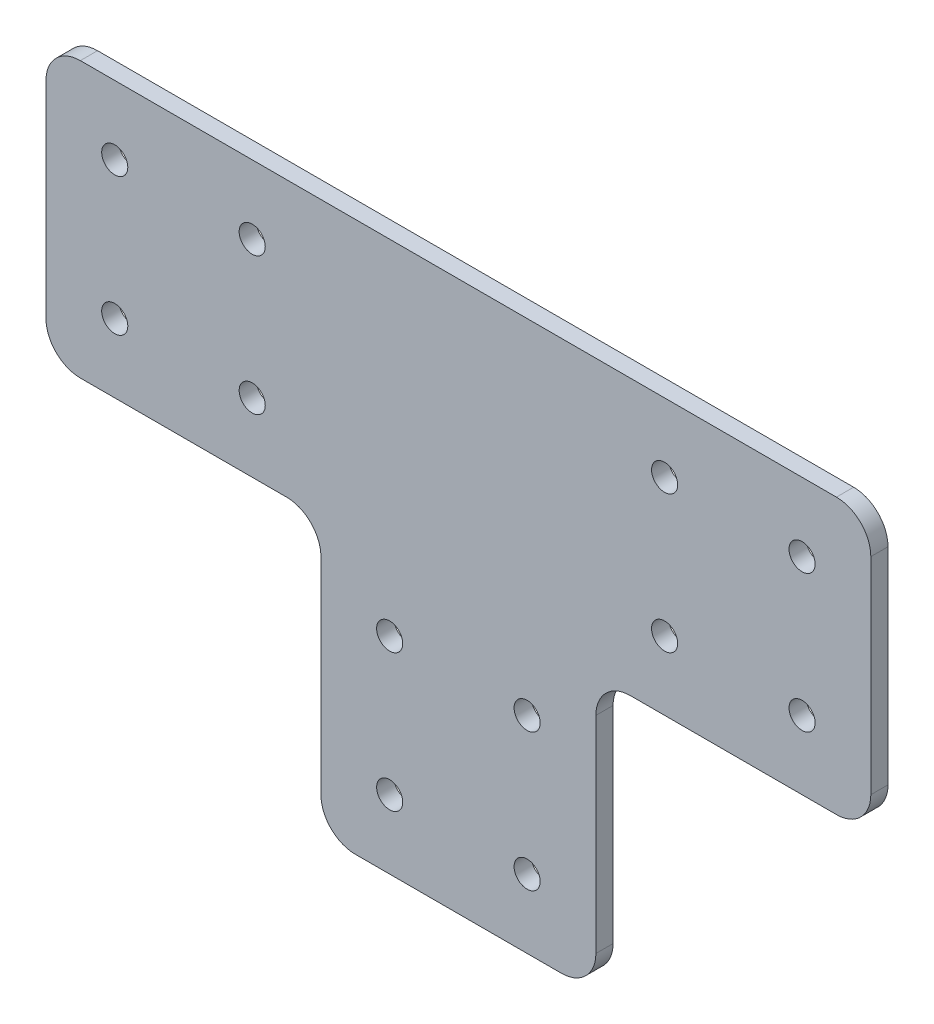
ISO-10303-21;
HEADER;
FILE_DESCRIPTION(('STEP AP214'),'2;1');
FILE_NAME('part.step','',(''),(''),'','','');
FILE_SCHEMA(('AUTOMOTIVE_DESIGN { 1 0 10303 214 1 1 1 1 }'));
ENDSEC;
DATA;
#1=APPLICATION_CONTEXT('core data for automotive mechanical design processes');
#2=APPLICATION_PROTOCOL_DEFINITION('international standard','automotive_design',2000,#1);
#3=PRODUCT_CONTEXT('',#1,'mechanical');
#4=PRODUCT('Part','Part','',(#3));
#5=PRODUCT_RELATED_PRODUCT_CATEGORY('part','',(#4));
#6=PRODUCT_DEFINITION_FORMATION('','',#4);
#7=PRODUCT_DEFINITION_CONTEXT('part definition',#1,'design');
#8=PRODUCT_DEFINITION('design','',#6,#7);
#9=PRODUCT_DEFINITION_SHAPE('','',#8);
#10=(LENGTH_UNIT() NAMED_UNIT(*) SI_UNIT(.MILLI.,.METRE.));
#11=(NAMED_UNIT(*) PLANE_ANGLE_UNIT() SI_UNIT($,.RADIAN.));
#12=(NAMED_UNIT(*) SI_UNIT($,.STERADIAN.) SOLID_ANGLE_UNIT());
#13=UNCERTAINTY_MEASURE_WITH_UNIT(LENGTH_MEASURE(1.E-05),#10,'distance_accuracy_value','');
#14=(GEOMETRIC_REPRESENTATION_CONTEXT(3) GLOBAL_UNCERTAINTY_ASSIGNED_CONTEXT((#13)) GLOBAL_UNIT_ASSIGNED_CONTEXT((#10,
#11,#12)) REPRESENTATION_CONTEXT('',''));
#15=CARTESIAN_POINT('',(0.,0.,0.));
#16=DIRECTION('',(0.,0.,1.));
#17=DIRECTION('',(1.,0.,0.));
#18=AXIS2_PLACEMENT_3D('',#15,#16,#17);
#19=CARTESIAN_POINT('',(0.,0.,3.175));
#20=DIRECTION('',(0.,0.,-1.));
#21=DIRECTION('',(-1.,0.,0.));
#22=AXIS2_PLACEMENT_3D('',#19,#20,#21);
#23=PLANE('',#22);
#24=DIRECTION('',(1.,0.,0.));
#25=VECTOR('',#24,1.);
#26=CARTESIAN_POINT('',(25.4,-101.6,3.175));
#27=LINE('',#26,#25);
#28=CARTESIAN_POINT('',(-19.05,-101.6,3.175));
#29=VERTEX_POINT('',#28);
#30=CARTESIAN_POINT('',(19.05,-101.6,3.175));
#31=VERTEX_POINT('',#30);
#32=EDGE_CURVE('E185',#29,#31,#27,.T.);
#33=ORIENTED_EDGE('',*,*,#32,.T.);
#34=CARTESIAN_POINT('',(19.05,-95.25,3.175));
#35=DIRECTION('',(0.,0.,-1.));
#36=DIRECTION('',(-1.,0.,0.));
#37=AXIS2_PLACEMENT_3D('',#34,#35,#36);
#38=CIRCLE('',#37,6.35);
#39=CARTESIAN_POINT('',(25.4,-95.25,3.175));
#40=VERTEX_POINT('',#39);
#41=EDGE_CURVE('E225',#31,#40,#38,.F.);
#42=ORIENTED_EDGE('',*,*,#41,.T.);
#43=DIRECTION('',(0.,1.,0.));
#44=VECTOR('',#43,1.);
#45=CARTESIAN_POINT('',(25.4,-50.8,3.175));
#46=LINE('',#45,#44);
#47=CARTESIAN_POINT('',(25.4,-57.15,3.175));
#48=VERTEX_POINT('',#47);
#49=EDGE_CURVE('E168',#40,#48,#46,.T.);
#50=ORIENTED_EDGE('',*,*,#49,.T.);
#51=CARTESIAN_POINT('',(31.75,-57.15,3.175));
#52=DIRECTION('',(0.,0.,-1.));
#53=DIRECTION('',(-1.,0.,0.));
#54=AXIS2_PLACEMENT_3D('',#51,#52,#53);
#55=CIRCLE('',#54,6.35);
#56=CARTESIAN_POINT('',(31.75,-50.8,3.175));
#57=VERTEX_POINT('',#56);
#58=EDGE_CURVE('E11',#48,#57,#55,.T.);
#59=ORIENTED_EDGE('',*,*,#58,.T.);
#60=DIRECTION('',(1.,0.,0.));
#61=VECTOR('',#60,1.);
#62=CARTESIAN_POINT('',(76.2,-50.8,3.175));
#63=LINE('',#62,#61);
#64=CARTESIAN_POINT('',(69.85,-50.8,3.175));
#65=VERTEX_POINT('',#64);
#66=EDGE_CURVE('E284',#57,#65,#63,.T.);
#67=ORIENTED_EDGE('',*,*,#66,.T.);
#68=CARTESIAN_POINT('',(69.85,-44.45,3.175));
#69=DIRECTION('',(0.,0.,-1.));
#70=DIRECTION('',(-1.,0.,0.));
#71=AXIS2_PLACEMENT_3D('',#68,#69,#70);
#72=CIRCLE('',#71,6.35);
#73=CARTESIAN_POINT('',(76.2,-44.45,3.175));
#74=VERTEX_POINT('',#73);
#75=EDGE_CURVE('E217',#65,#74,#72,.F.);
#76=ORIENTED_EDGE('',*,*,#75,.T.);
#77=DIRECTION('',(0.,1.,0.));
#78=VECTOR('',#77,1.);
#79=CARTESIAN_POINT('',(76.2,0.,3.175));
#80=LINE('',#79,#78);
#81=CARTESIAN_POINT('',(76.2,-6.35,3.175));
#82=VERTEX_POINT('',#81);
#83=EDGE_CURVE('E281',#74,#82,#80,.T.);
#84=ORIENTED_EDGE('',*,*,#83,.T.);
#85=CARTESIAN_POINT('',(69.85,-6.35,3.175));
#86=DIRECTION('',(0.,0.,-1.));
#87=DIRECTION('',(-1.,0.,0.));
#88=AXIS2_PLACEMENT_3D('',#85,#86,#87);
#89=CIRCLE('',#88,6.35);
#90=CARTESIAN_POINT('',(69.85,0.,3.175));
#91=VERTEX_POINT('',#90);
#92=EDGE_CURVE('E219',#82,#91,#89,.F.);
#93=ORIENTED_EDGE('',*,*,#92,.T.);
#94=DIRECTION('',(-1.,0.,0.));
#95=VECTOR('',#94,1.);
#96=CARTESIAN_POINT('',(-76.2,0.,3.175));
#97=LINE('',#96,#95);
#98=CARTESIAN_POINT('',(-69.85,0.,3.175));
#99=VERTEX_POINT('',#98);
#100=EDGE_CURVE('E278',#91,#99,#97,.T.);
#101=ORIENTED_EDGE('',*,*,#100,.T.);
#102=CARTESIAN_POINT('',(-69.85,-6.35,3.175));
#103=DIRECTION('',(0.,0.,-1.));
#104=DIRECTION('',(-1.,0.,0.));
#105=AXIS2_PLACEMENT_3D('',#102,#103,#104);
#106=CIRCLE('',#105,6.35);
#107=CARTESIAN_POINT('',(-76.2,-6.35,3.175));
#108=VERTEX_POINT('',#107);
#109=EDGE_CURVE('E215',#99,#108,#106,.F.);
#110=ORIENTED_EDGE('',*,*,#109,.T.);
#111=DIRECTION('',(0.,-1.,0.));
#112=VECTOR('',#111,1.);
#113=CARTESIAN_POINT('',(-76.2,-50.8,3.175));
#114=LINE('',#113,#112);
#115=CARTESIAN_POINT('',(-76.2,-44.45,3.175));
#116=VERTEX_POINT('',#115);
#117=EDGE_CURVE('E273',#108,#116,#114,.T.);
#118=ORIENTED_EDGE('',*,*,#117,.T.);
#119=CARTESIAN_POINT('',(-69.85,-44.45,3.175));
#120=DIRECTION('',(0.,0.,-1.));
#121=DIRECTION('',(-1.,0.,0.));
#122=AXIS2_PLACEMENT_3D('',#119,#120,#121);
#123=CIRCLE('',#122,6.35);
#124=CARTESIAN_POINT('',(-69.85,-50.8,3.175));
#125=VERTEX_POINT('',#124);
#126=EDGE_CURVE('E221',#116,#125,#123,.F.);
#127=ORIENTED_EDGE('',*,*,#126,.T.);
#128=DIRECTION('',(1.,0.,0.));
#129=VECTOR('',#128,1.);
#130=CARTESIAN_POINT('',(-25.4,-50.8,3.175));
#131=LINE('',#130,#129);
#132=CARTESIAN_POINT('',(-31.75,-50.8,3.175));
#133=VERTEX_POINT('',#132);
#134=EDGE_CURVE('E271',#125,#133,#131,.T.);
#135=ORIENTED_EDGE('',*,*,#134,.T.);
#136=CARTESIAN_POINT('',(-31.75,-57.15,3.175));
#137=DIRECTION('',(0.,0.,-1.));
#138=DIRECTION('',(-1.,0.,0.));
#139=AXIS2_PLACEMENT_3D('',#136,#137,#138);
#140=CIRCLE('',#139,6.35);
#141=CARTESIAN_POINT('',(-25.4,-57.15,3.175));
#142=VERTEX_POINT('',#141);
#143=EDGE_CURVE('E56',#133,#142,#140,.T.);
#144=ORIENTED_EDGE('',*,*,#143,.T.);
#145=DIRECTION('',(0.,-1.,0.));
#146=VECTOR('',#145,1.);
#147=CARTESIAN_POINT('',(-25.4,-101.6,3.175));
#148=LINE('',#147,#146);
#149=CARTESIAN_POINT('',(-25.4,-95.25,3.175));
#150=VERTEX_POINT('',#149);
#151=EDGE_CURVE('E269',#142,#150,#148,.T.);
#152=ORIENTED_EDGE('',*,*,#151,.T.);
#153=CARTESIAN_POINT('',(-19.05,-95.25,3.175));
#154=DIRECTION('',(0.,0.,-1.));
#155=DIRECTION('',(-1.,0.,0.));
#156=AXIS2_PLACEMENT_3D('',#153,#154,#155);
#157=CIRCLE('',#156,6.35);
#158=EDGE_CURVE('E223',#150,#29,#157,.F.);
#159=ORIENTED_EDGE('',*,*,#158,.T.);
#160=EDGE_LOOP('',(#33,#42,#50,#59,#67,#76,#84,#93,#101,#110,#118,#127,#135,#144,#152,#159));
#161=FACE_BOUND('',#160,.T.);
#162=CARTESIAN_POINT('',(-63.5,-12.7,3.175));
#163=DIRECTION('',(0.,0.,1.));
#164=DIRECTION('',(1.,0.,0.));
#165=AXIS2_PLACEMENT_3D('',#162,#163,#164);
#166=CIRCLE('',#165,2.41299999999999);
#167=CARTESIAN_POINT('',(-61.087,-12.7,3.175));
#168=VERTEX_POINT('',#167);
#169=EDGE_CURVE('E176',#168,#168,#166,.T.);
#170=ORIENTED_EDGE('',*,*,#169,.F.);
#171=EDGE_LOOP('',(#170));
#172=FACE_BOUND('',#171,.T.);
#173=CARTESIAN_POINT('',(-63.5,-38.1,3.175));
#174=DIRECTION('',(0.,0.,1.));
#175=DIRECTION('',(1.,0.,0.));
#176=AXIS2_PLACEMENT_3D('',#173,#174,#175);
#177=CIRCLE('',#176,2.41299999999999);
#178=CARTESIAN_POINT('',(-61.087,-38.1,3.175));
#179=VERTEX_POINT('',#178);
#180=EDGE_CURVE('E289',#179,#179,#177,.T.);
#181=ORIENTED_EDGE('',*,*,#180,.F.);
#182=EDGE_LOOP('',(#181));
#183=FACE_BOUND('',#182,.T.);
#184=CARTESIAN_POINT('',(-38.1,-12.7,3.175));
#185=DIRECTION('',(0.,0.,1.));
#186=DIRECTION('',(1.,0.,0.));
#187=AXIS2_PLACEMENT_3D('',#184,#185,#186);
#188=CIRCLE('',#187,2.413);
#189=CARTESIAN_POINT('',(-35.687,-12.7,3.175));
#190=VERTEX_POINT('',#189);
#191=EDGE_CURVE('E294',#190,#190,#188,.T.);
#192=ORIENTED_EDGE('',*,*,#191,.F.);
#193=EDGE_LOOP('',(#192));
#194=FACE_BOUND('',#193,.T.);
#195=CARTESIAN_POINT('',(-38.1,-38.1,3.175));
#196=DIRECTION('',(0.,0.,1.));
#197=DIRECTION('',(1.,0.,0.));
#198=AXIS2_PLACEMENT_3D('',#195,#196,#197);
#199=CIRCLE('',#198,2.413);
#200=CARTESIAN_POINT('',(-35.687,-38.1,3.175));
#201=VERTEX_POINT('',#200);
#202=EDGE_CURVE('E300',#201,#201,#199,.T.);
#203=ORIENTED_EDGE('',*,*,#202,.F.);
#204=EDGE_LOOP('',(#203));
#205=FACE_BOUND('',#204,.T.);
#206=CARTESIAN_POINT('',(-12.7,-88.9,3.175));
#207=DIRECTION('',(0.,0.,1.));
#208=DIRECTION('',(1.,0.,0.));
#209=AXIS2_PLACEMENT_3D('',#206,#207,#208);
#210=CIRCLE('',#209,2.413);
#211=CARTESIAN_POINT('',(-10.287,-88.9,3.175));
#212=VERTEX_POINT('',#211);
#213=EDGE_CURVE('E306',#212,#212,#210,.T.);
#214=ORIENTED_EDGE('',*,*,#213,.F.);
#215=EDGE_LOOP('',(#214));
#216=FACE_BOUND('',#215,.T.);
#217=CARTESIAN_POINT('',(-12.7,-63.5,3.175));
#218=DIRECTION('',(0.,0.,1.));
#219=DIRECTION('',(1.,0.,0.));
#220=AXIS2_PLACEMENT_3D('',#217,#218,#219);
#221=CIRCLE('',#220,2.413);
#222=CARTESIAN_POINT('',(-10.287,-63.5,3.175));
#223=VERTEX_POINT('',#222);
#224=EDGE_CURVE('E312',#223,#223,#221,.T.);
#225=ORIENTED_EDGE('',*,*,#224,.F.);
#226=EDGE_LOOP('',(#225));
#227=FACE_BOUND('',#226,.T.);
#228=CARTESIAN_POINT('',(12.7,-88.9,3.175));
#229=DIRECTION('',(0.,0.,1.));
#230=DIRECTION('',(-1.,0.,0.));
#231=AXIS2_PLACEMENT_3D('',#228,#229,#230);
#232=CIRCLE('',#231,2.413);
#233=CARTESIAN_POINT('',(10.287,-88.9,3.175));
#234=VERTEX_POINT('',#233);
#235=EDGE_CURVE('E318',#234,#234,#232,.T.);
#236=ORIENTED_EDGE('',*,*,#235,.F.);
#237=EDGE_LOOP('',(#236));
#238=FACE_BOUND('',#237,.T.);
#239=CARTESIAN_POINT('',(12.7,-63.5,3.175));
#240=DIRECTION('',(0.,0.,1.));
#241=DIRECTION('',(-1.,0.,0.));
#242=AXIS2_PLACEMENT_3D('',#239,#240,#241);
#243=CIRCLE('',#242,2.413);
#244=CARTESIAN_POINT('',(10.287,-63.5,3.175));
#245=VERTEX_POINT('',#244);
#246=EDGE_CURVE('E324',#245,#245,#243,.T.);
#247=ORIENTED_EDGE('',*,*,#246,.F.);
#248=EDGE_LOOP('',(#247));
#249=FACE_BOUND('',#248,.T.);
#250=CARTESIAN_POINT('',(63.5,-38.1,3.175));
#251=DIRECTION('',(0.,0.,1.));
#252=DIRECTION('',(-1.,0.,0.));
#253=AXIS2_PLACEMENT_3D('',#250,#251,#252);
#254=CIRCLE('',#253,2.41299999999999);
#255=CARTESIAN_POINT('',(61.087,-38.1,3.175));
#256=VERTEX_POINT('',#255);
#257=EDGE_CURVE('E330',#256,#256,#254,.T.);
#258=ORIENTED_EDGE('',*,*,#257,.F.);
#259=EDGE_LOOP('',(#258));
#260=FACE_BOUND('',#259,.T.);
#261=CARTESIAN_POINT('',(38.1,-38.1,3.175));
#262=DIRECTION('',(0.,0.,1.));
#263=DIRECTION('',(-1.,0.,0.));
#264=AXIS2_PLACEMENT_3D('',#261,#262,#263);
#265=CIRCLE('',#264,2.413);
#266=CARTESIAN_POINT('',(35.687,-38.1,3.175));
#267=VERTEX_POINT('',#266);
#268=EDGE_CURVE('E336',#267,#267,#265,.T.);
#269=ORIENTED_EDGE('',*,*,#268,.F.);
#270=EDGE_LOOP('',(#269));
#271=FACE_BOUND('',#270,.T.);
#272=CARTESIAN_POINT('',(38.1,-12.7,3.175));
#273=DIRECTION('',(0.,0.,1.));
#274=DIRECTION('',(-1.,0.,0.));
#275=AXIS2_PLACEMENT_3D('',#272,#273,#274);
#276=CIRCLE('',#275,2.413);
#277=CARTESIAN_POINT('',(35.687,-12.7,3.175));
#278=VERTEX_POINT('',#277);
#279=EDGE_CURVE('E342',#278,#278,#276,.T.);
#280=ORIENTED_EDGE('',*,*,#279,.F.);
#281=EDGE_LOOP('',(#280));
#282=FACE_BOUND('',#281,.T.);
#283=CARTESIAN_POINT('',(63.5,-12.7,3.175));
#284=DIRECTION('',(0.,0.,1.));
#285=DIRECTION('',(-1.,0.,0.));
#286=AXIS2_PLACEMENT_3D('',#283,#284,#285);
#287=CIRCLE('',#286,2.41299999999999);
#288=CARTESIAN_POINT('',(61.087,-12.7,3.175));
#289=VERTEX_POINT('',#288);
#290=EDGE_CURVE('E348',#289,#289,#287,.T.);
#291=ORIENTED_EDGE('',*,*,#290,.F.);
#292=EDGE_LOOP('',(#291));
#293=FACE_BOUND('',#292,.T.);
#294=ADVANCED_FACE('F34',(#161,#172,#183,#194,#205,#216,#227,#238,#249,#260,#271,#282,#293),#23,.F.);
#295=CARTESIAN_POINT('',(0.,0.,0.));
#296=DIRECTION('',(0.,0.,-1.));
#297=DIRECTION('',(-1.,0.,0.));
#298=AXIS2_PLACEMENT_3D('',#295,#296,#297);
#299=PLANE('',#298);
#300=CARTESIAN_POINT('',(38.1,-12.7,0.));
#301=DIRECTION('',(0.,0.,1.));
#302=DIRECTION('',(-1.,0.,0.));
#303=AXIS2_PLACEMENT_3D('',#300,#301,#302);
#304=CIRCLE('',#303,2.413);
#305=CARTESIAN_POINT('',(35.687,-12.7,0.));
#306=VERTEX_POINT('',#305);
#307=EDGE_CURVE('E345',#306,#306,#304,.T.);
#308=ORIENTED_EDGE('',*,*,#307,.T.);
#309=EDGE_LOOP('',(#308));
#310=FACE_BOUND('',#309,.T.);
#311=CARTESIAN_POINT('',(63.5,-38.1,0.));
#312=DIRECTION('',(0.,0.,1.));
#313=DIRECTION('',(-1.,0.,0.));
#314=AXIS2_PLACEMENT_3D('',#311,#312,#313);
#315=CIRCLE('',#314,2.41299999999999);
#316=CARTESIAN_POINT('',(61.087,-38.1,0.));
#317=VERTEX_POINT('',#316);
#318=EDGE_CURVE('E333',#317,#317,#315,.T.);
#319=ORIENTED_EDGE('',*,*,#318,.T.);
#320=EDGE_LOOP('',(#319));
#321=FACE_BOUND('',#320,.T.);
#322=CARTESIAN_POINT('',(12.7,-88.9,0.));
#323=DIRECTION('',(0.,0.,1.));
#324=DIRECTION('',(-1.,0.,0.));
#325=AXIS2_PLACEMENT_3D('',#322,#323,#324);
#326=CIRCLE('',#325,2.413);
#327=CARTESIAN_POINT('',(10.287,-88.9,0.));
#328=VERTEX_POINT('',#327);
#329=EDGE_CURVE('E321',#328,#328,#326,.T.);
#330=ORIENTED_EDGE('',*,*,#329,.T.);
#331=EDGE_LOOP('',(#330));
#332=FACE_BOUND('',#331,.T.);
#333=CARTESIAN_POINT('',(-12.7,-88.9,0.));
#334=DIRECTION('',(0.,0.,1.));
#335=DIRECTION('',(1.,0.,0.));
#336=AXIS2_PLACEMENT_3D('',#333,#334,#335);
#337=CIRCLE('',#336,2.413);
#338=CARTESIAN_POINT('',(-10.287,-88.9,0.));
#339=VERTEX_POINT('',#338);
#340=EDGE_CURVE('E309',#339,#339,#337,.T.);
#341=ORIENTED_EDGE('',*,*,#340,.T.);
#342=EDGE_LOOP('',(#341));
#343=FACE_BOUND('',#342,.T.);
#344=CARTESIAN_POINT('',(-38.1,-12.7,0.));
#345=DIRECTION('',(0.,0.,1.));
#346=DIRECTION('',(1.,0.,0.));
#347=AXIS2_PLACEMENT_3D('',#344,#345,#346);
#348=CIRCLE('',#347,2.413);
#349=CARTESIAN_POINT('',(-35.687,-12.7,0.));
#350=VERTEX_POINT('',#349);
#351=EDGE_CURVE('E297',#350,#350,#348,.T.);
#352=ORIENTED_EDGE('',*,*,#351,.T.);
#353=EDGE_LOOP('',(#352));
#354=FACE_BOUND('',#353,.T.);
#355=CARTESIAN_POINT('',(-63.5,-12.7,0.));
#356=DIRECTION('',(0.,0.,1.));
#357=DIRECTION('',(1.,0.,0.));
#358=AXIS2_PLACEMENT_3D('',#355,#356,#357);
#359=CIRCLE('',#358,2.41299999999999);
#360=CARTESIAN_POINT('',(-61.087,-12.7,0.));
#361=VERTEX_POINT('',#360);
#362=EDGE_CURVE('E182',#361,#361,#359,.T.);
#363=ORIENTED_EDGE('',*,*,#362,.T.);
#364=EDGE_LOOP('',(#363));
#365=FACE_BOUND('',#364,.T.);
#366=DIRECTION('',(0.,1.,0.));
#367=VECTOR('',#366,1.);
#368=CARTESIAN_POINT('',(25.4,-50.8,0.));
#369=LINE('',#368,#367);
#370=CARTESIAN_POINT('',(25.4,-95.25,0.));
#371=VERTEX_POINT('',#370);
#372=CARTESIAN_POINT('',(25.4,-57.15,0.));
#373=VERTEX_POINT('',#372);
#374=EDGE_CURVE('E165',#371,#373,#369,.T.);
#375=ORIENTED_EDGE('',*,*,#374,.F.);
#376=CARTESIAN_POINT('',(19.05,-95.25,0.));
#377=DIRECTION('',(0.,0.,-1.));
#378=DIRECTION('',(-1.,0.,0.));
#379=AXIS2_PLACEMENT_3D('',#376,#377,#378);
#380=CIRCLE('',#379,6.35);
#381=CARTESIAN_POINT('',(19.05,-101.6,0.));
#382=VERTEX_POINT('',#381);
#383=EDGE_CURVE('E148',#371,#382,#380,.T.);
#384=ORIENTED_EDGE('',*,*,#383,.T.);
#385=DIRECTION('',(1.,0.,0.));
#386=VECTOR('',#385,1.);
#387=CARTESIAN_POINT('',(25.4,-101.6,0.));
#388=LINE('',#387,#386);
#389=CARTESIAN_POINT('',(-19.05,-101.6,0.));
#390=VERTEX_POINT('',#389);
#391=EDGE_CURVE('E201',#390,#382,#388,.T.);
#392=ORIENTED_EDGE('',*,*,#391,.F.);
#393=CARTESIAN_POINT('',(-19.05,-95.25,0.));
#394=DIRECTION('',(0.,0.,-1.));
#395=DIRECTION('',(-1.,0.,0.));
#396=AXIS2_PLACEMENT_3D('',#393,#394,#395);
#397=CIRCLE('',#396,6.35);
#398=CARTESIAN_POINT('',(-25.4,-95.25,0.));
#399=VERTEX_POINT('',#398);
#400=EDGE_CURVE('E159',#390,#399,#397,.T.);
#401=ORIENTED_EDGE('',*,*,#400,.T.);
#402=DIRECTION('',(0.,-1.,0.));
#403=VECTOR('',#402,1.);
#404=CARTESIAN_POINT('',(-25.4,-101.6,0.));
#405=LINE('',#404,#403);
#406=CARTESIAN_POINT('',(-25.4,-57.15,0.));
#407=VERTEX_POINT('',#406);
#408=EDGE_CURVE('E199',#407,#399,#405,.T.);
#409=ORIENTED_EDGE('',*,*,#408,.F.);
#410=CARTESIAN_POINT('',(-31.75,-57.15,0.));
#411=DIRECTION('',(0.,0.,-1.));
#412=DIRECTION('',(-1.,0.,0.));
#413=AXIS2_PLACEMENT_3D('',#410,#411,#412);
#414=CIRCLE('',#413,6.35);
#415=CARTESIAN_POINT('',(-31.75,-50.8,0.));
#416=VERTEX_POINT('',#415);
#417=EDGE_CURVE('E256',#407,#416,#414,.F.);
#418=ORIENTED_EDGE('',*,*,#417,.T.);
#419=DIRECTION('',(1.,0.,0.));
#420=VECTOR('',#419,1.);
#421=CARTESIAN_POINT('',(-25.4,-50.8,0.));
#422=LINE('',#421,#420);
#423=CARTESIAN_POINT('',(-69.85,-50.8,0.));
#424=VERTEX_POINT('',#423);
#425=EDGE_CURVE('E196',#424,#416,#422,.T.);
#426=ORIENTED_EDGE('',*,*,#425,.F.);
#427=CARTESIAN_POINT('',(-69.85,-44.45,0.));
#428=DIRECTION('',(0.,0.,-1.));
#429=DIRECTION('',(-1.,0.,0.));
#430=AXIS2_PLACEMENT_3D('',#427,#428,#429);
#431=CIRCLE('',#430,6.35);
#432=CARTESIAN_POINT('',(-76.2,-44.45,0.));
#433=VERTEX_POINT('',#432);
#434=EDGE_CURVE('E209',#424,#433,#431,.T.);
#435=ORIENTED_EDGE('',*,*,#434,.T.);
#436=DIRECTION('',(0.,-1.,0.));
#437=VECTOR('',#436,1.);
#438=CARTESIAN_POINT('',(-76.2,-50.8,0.));
#439=LINE('',#438,#437);
#440=CARTESIAN_POINT('',(-76.2,-6.35,0.));
#441=VERTEX_POINT('',#440);
#442=EDGE_CURVE('E193',#441,#433,#439,.T.);
#443=ORIENTED_EDGE('',*,*,#442,.F.);
#444=CARTESIAN_POINT('',(-69.85,-6.35,0.));
#445=DIRECTION('',(0.,0.,-1.));
#446=DIRECTION('',(-1.,0.,0.));
#447=AXIS2_PLACEMENT_3D('',#444,#445,#446);
#448=CIRCLE('',#447,6.35);
#449=CARTESIAN_POINT('',(-69.85,0.,0.));
#450=VERTEX_POINT('',#449);
#451=EDGE_CURVE('E169',#441,#450,#448,.T.);
#452=ORIENTED_EDGE('',*,*,#451,.T.);
#453=DIRECTION('',(-1.,0.,0.));
#454=VECTOR('',#453,1.);
#455=CARTESIAN_POINT('',(-76.2,0.,0.));
#456=LINE('',#455,#454);
#457=CARTESIAN_POINT('',(69.85,0.,0.));
#458=VERTEX_POINT('',#457);
#459=EDGE_CURVE('E190',#458,#450,#456,.T.);
#460=ORIENTED_EDGE('',*,*,#459,.F.);
#461=CARTESIAN_POINT('',(69.85,-6.35,0.));
#462=DIRECTION('',(0.,0.,-1.));
#463=DIRECTION('',(-1.,0.,0.));
#464=AXIS2_PLACEMENT_3D('',#461,#462,#463);
#465=CIRCLE('',#464,6.35);
#466=CARTESIAN_POINT('',(76.2,-6.35,0.));
#467=VERTEX_POINT('',#466);
#468=EDGE_CURVE('E207',#458,#467,#465,.T.);
#469=ORIENTED_EDGE('',*,*,#468,.T.);
#470=DIRECTION('',(0.,1.,0.));
#471=VECTOR('',#470,1.);
#472=CARTESIAN_POINT('',(76.2,0.,0.));
#473=LINE('',#472,#471);
#474=CARTESIAN_POINT('',(76.2,-44.45,0.));
#475=VERTEX_POINT('',#474);
#476=EDGE_CURVE('E179',#475,#467,#473,.T.);
#477=ORIENTED_EDGE('',*,*,#476,.F.);
#478=CARTESIAN_POINT('',(69.85,-44.45,0.));
#479=DIRECTION('',(0.,0.,-1.));
#480=DIRECTION('',(-1.,0.,0.));
#481=AXIS2_PLACEMENT_3D('',#478,#479,#480);
#482=CIRCLE('',#481,6.35);
#483=CARTESIAN_POINT('',(69.85,-50.8,0.));
#484=VERTEX_POINT('',#483);
#485=EDGE_CURVE('E205',#475,#484,#482,.T.);
#486=ORIENTED_EDGE('',*,*,#485,.T.);
#487=DIRECTION('',(1.,0.,0.));
#488=VECTOR('',#487,1.);
#489=CARTESIAN_POINT('',(76.2,-50.8,0.));
#490=LINE('',#489,#488);
#491=CARTESIAN_POINT('',(31.75,-50.8,0.));
#492=VERTEX_POINT('',#491);
#493=EDGE_CURVE('E175',#492,#484,#490,.T.);
#494=ORIENTED_EDGE('',*,*,#493,.F.);
#495=CARTESIAN_POINT('',(31.75,-57.15,0.));
#496=DIRECTION('',(0.,0.,-1.));
#497=DIRECTION('',(-1.,0.,0.));
#498=AXIS2_PLACEMENT_3D('',#495,#496,#497);
#499=CIRCLE('',#498,6.35);
#500=EDGE_CURVE('E42',#492,#373,#499,.F.);
#501=ORIENTED_EDGE('',*,*,#500,.T.);
#502=EDGE_LOOP('',(#375,#384,#392,#401,#409,#418,#426,#435,#443,#452,#460,#469,#477,#486,#494,#501));
#503=FACE_BOUND('',#502,.T.);
#504=CARTESIAN_POINT('',(-63.5,-38.1,0.));
#505=DIRECTION('',(0.,0.,1.));
#506=DIRECTION('',(1.,0.,0.));
#507=AXIS2_PLACEMENT_3D('',#504,#505,#506);
#508=CIRCLE('',#507,2.41299999999999);
#509=CARTESIAN_POINT('',(-61.087,-38.1,0.));
#510=VERTEX_POINT('',#509);
#511=EDGE_CURVE('E291',#510,#510,#508,.T.);
#512=ORIENTED_EDGE('',*,*,#511,.T.);
#513=EDGE_LOOP('',(#512));
#514=FACE_BOUND('',#513,.T.);
#515=CARTESIAN_POINT('',(-38.1,-38.1,0.));
#516=DIRECTION('',(0.,0.,1.));
#517=DIRECTION('',(1.,0.,0.));
#518=AXIS2_PLACEMENT_3D('',#515,#516,#517);
#519=CIRCLE('',#518,2.413);
#520=CARTESIAN_POINT('',(-35.687,-38.1,0.));
#521=VERTEX_POINT('',#520);
#522=EDGE_CURVE('E303',#521,#521,#519,.T.);
#523=ORIENTED_EDGE('',*,*,#522,.T.);
#524=EDGE_LOOP('',(#523));
#525=FACE_BOUND('',#524,.T.);
#526=CARTESIAN_POINT('',(-12.7,-63.5,0.));
#527=DIRECTION('',(0.,0.,1.));
#528=DIRECTION('',(1.,0.,0.));
#529=AXIS2_PLACEMENT_3D('',#526,#527,#528);
#530=CIRCLE('',#529,2.413);
#531=CARTESIAN_POINT('',(-10.287,-63.5,0.));
#532=VERTEX_POINT('',#531);
#533=EDGE_CURVE('E315',#532,#532,#530,.T.);
#534=ORIENTED_EDGE('',*,*,#533,.T.);
#535=EDGE_LOOP('',(#534));
#536=FACE_BOUND('',#535,.T.);
#537=CARTESIAN_POINT('',(12.7,-63.5,0.));
#538=DIRECTION('',(0.,0.,1.));
#539=DIRECTION('',(-1.,0.,0.));
#540=AXIS2_PLACEMENT_3D('',#537,#538,#539);
#541=CIRCLE('',#540,2.413);
#542=CARTESIAN_POINT('',(10.287,-63.5,0.));
#543=VERTEX_POINT('',#542);
#544=EDGE_CURVE('E327',#543,#543,#541,.T.);
#545=ORIENTED_EDGE('',*,*,#544,.T.);
#546=EDGE_LOOP('',(#545));
#547=FACE_BOUND('',#546,.T.);
#548=CARTESIAN_POINT('',(38.1,-38.1,0.));
#549=DIRECTION('',(0.,0.,1.));
#550=DIRECTION('',(-1.,0.,0.));
#551=AXIS2_PLACEMENT_3D('',#548,#549,#550);
#552=CIRCLE('',#551,2.413);
#553=CARTESIAN_POINT('',(35.687,-38.1,0.));
#554=VERTEX_POINT('',#553);
#555=EDGE_CURVE('E339',#554,#554,#552,.T.);
#556=ORIENTED_EDGE('',*,*,#555,.T.);
#557=EDGE_LOOP('',(#556));
#558=FACE_BOUND('',#557,.T.);
#559=CARTESIAN_POINT('',(63.5,-12.7,0.));
#560=DIRECTION('',(0.,0.,1.));
#561=DIRECTION('',(-1.,0.,0.));
#562=AXIS2_PLACEMENT_3D('',#559,#560,#561);
#563=CIRCLE('',#562,2.41299999999999);
#564=CARTESIAN_POINT('',(61.087,-12.7,0.));
#565=VERTEX_POINT('',#564);
#566=EDGE_CURVE('E351',#565,#565,#563,.T.);
#567=ORIENTED_EDGE('',*,*,#566,.T.);
#568=EDGE_LOOP('',(#567));
#569=FACE_BOUND('',#568,.T.);
#570=ADVANCED_FACE('F172',(#310,#321,#332,#343,#354,#365,#503,#514,#525,#536,#547,#558,#569),
#299,.T.);
#571=CARTESIAN_POINT('',(25.4,-50.8,3.175));
#572=DIRECTION('',(-1.,0.,0.));
#573=DIRECTION('',(0.,0.,1.));
#574=AXIS2_PLACEMENT_3D('',#571,#572,#573);
#575=PLANE('',#574);
#576=ORIENTED_EDGE('',*,*,#49,.F.);
#577=DIRECTION('',(0.,0.,-1.));
#578=VECTOR('',#577,1.);
#579=CARTESIAN_POINT('',(25.4,-95.25,3.175));
#580=LINE('',#579,#578);
#581=EDGE_CURVE('E152',#40,#371,#580,.T.);
#582=ORIENTED_EDGE('',*,*,#581,.T.);
#583=ORIENTED_EDGE('',*,*,#374,.T.);
#584=DIRECTION('',(0.,0.,-1.));
#585=VECTOR('',#584,1.);
#586=CARTESIAN_POINT('',(25.4,-57.15,3.175));
#587=LINE('',#586,#585);
#588=EDGE_CURVE('E170',#373,#48,#587,.F.);
#589=ORIENTED_EDGE('',*,*,#588,.T.);
#590=EDGE_LOOP('',(#576,#582,#583,#589));
#591=FACE_BOUND('',#590,.T.);
#592=ADVANCED_FACE('F164',(#591),#575,.F.);
#593=CARTESIAN_POINT('',(76.2,-50.8,3.175));
#594=DIRECTION('',(0.,1.,0.));
#595=DIRECTION('',(-1.,0.,0.));
#596=AXIS2_PLACEMENT_3D('',#593,#594,#595);
#597=PLANE('',#596);
#598=ORIENTED_EDGE('',*,*,#493,.T.);
#599=DIRECTION('',(0.,0.,-1.));
#600=VECTOR('',#599,1.);
#601=CARTESIAN_POINT('',(69.85,-50.8,3.175));
#602=LINE('',#601,#600);
#603=EDGE_CURVE('E254',#484,#65,#602,.F.);
#604=ORIENTED_EDGE('',*,*,#603,.T.);
#605=ORIENTED_EDGE('',*,*,#66,.F.);
#606=DIRECTION('',(0.,0.,-1.));
#607=VECTOR('',#606,1.);
#608=CARTESIAN_POINT('',(31.75,-50.8,0.));
#609=LINE('',#608,#607);
#610=EDGE_CURVE('E251',#57,#492,#609,.T.);
#611=ORIENTED_EDGE('',*,*,#610,.T.);
#612=EDGE_LOOP('',(#598,#604,#605,#611));
#613=FACE_BOUND('',#612,.T.);
#614=ADVANCED_FACE('F391',(#613),#597,.F.);
#615=CARTESIAN_POINT('',(76.2,0.,3.175));
#616=DIRECTION('',(-1.,0.,0.));
#617=DIRECTION('',(0.,0.,1.));
#618=AXIS2_PLACEMENT_3D('',#615,#616,#617);
#619=PLANE('',#618);
#620=ORIENTED_EDGE('',*,*,#476,.T.);
#621=DIRECTION('',(0.,0.,-1.));
#622=VECTOR('',#621,1.);
#623=CARTESIAN_POINT('',(76.2,-6.35,3.175));
#624=LINE('',#623,#622);
#625=EDGE_CURVE('E249',#467,#82,#624,.F.);
#626=ORIENTED_EDGE('',*,*,#625,.T.);
#627=ORIENTED_EDGE('',*,*,#83,.F.);
#628=DIRECTION('',(0.,0.,-1.));
#629=VECTOR('',#628,1.);
#630=CARTESIAN_POINT('',(76.2,-44.45,3.175));
#631=LINE('',#630,#629);
#632=EDGE_CURVE('E246',#74,#475,#631,.T.);
#633=ORIENTED_EDGE('',*,*,#632,.T.);
#634=EDGE_LOOP('',(#620,#626,#627,#633));
#635=FACE_BOUND('',#634,.T.);
#636=ADVANCED_FACE('F387',(#635),#619,.F.);
#637=CARTESIAN_POINT('',(-76.2,0.,3.175));
#638=DIRECTION('',(0.,-1.,0.));
#639=DIRECTION('',(0.,0.,-1.));
#640=AXIS2_PLACEMENT_3D('',#637,#638,#639);
#641=PLANE('',#640);
#642=ORIENTED_EDGE('',*,*,#100,.F.);
#643=DIRECTION('',(0.,0.,-1.));
#644=VECTOR('',#643,1.);
#645=CARTESIAN_POINT('',(69.85,0.,3.175));
#646=LINE('',#645,#644);
#647=EDGE_CURVE('E243',#91,#458,#646,.T.);
#648=ORIENTED_EDGE('',*,*,#647,.T.);
#649=ORIENTED_EDGE('',*,*,#459,.T.);
#650=DIRECTION('',(0.,0.,-1.));
#651=VECTOR('',#650,1.);
#652=CARTESIAN_POINT('',(-69.85,0.,3.175));
#653=LINE('',#652,#651);
#654=EDGE_CURVE('E241',#450,#99,#653,.F.);
#655=ORIENTED_EDGE('',*,*,#654,.T.);
#656=EDGE_LOOP('',(#642,#648,#649,#655));
#657=FACE_BOUND('',#656,.T.);
#658=ADVANCED_FACE('F383',(#657),#641,.F.);
#659=CARTESIAN_POINT('',(-76.2,-50.8,3.175));
#660=DIRECTION('',(1.,0.,0.));
#661=DIRECTION('',(0.,0.,-1.));
#662=AXIS2_PLACEMENT_3D('',#659,#660,#661);
#663=PLANE('',#662);
#664=ORIENTED_EDGE('',*,*,#442,.T.);
#665=DIRECTION('',(0.,0.,-1.));
#666=VECTOR('',#665,1.);
#667=CARTESIAN_POINT('',(-76.2,-44.45,3.175));
#668=LINE('',#667,#666);
#669=EDGE_CURVE('E239',#433,#116,#668,.F.);
#670=ORIENTED_EDGE('',*,*,#669,.T.);
#671=ORIENTED_EDGE('',*,*,#117,.F.);
#672=DIRECTION('',(0.,0.,-1.));
#673=VECTOR('',#672,1.);
#674=CARTESIAN_POINT('',(-76.2,-6.35,3.175));
#675=LINE('',#674,#673);
#676=EDGE_CURVE('E236',#108,#441,#675,.T.);
#677=ORIENTED_EDGE('',*,*,#676,.T.);
#678=EDGE_LOOP('',(#664,#670,#671,#677));
#679=FACE_BOUND('',#678,.T.);
#680=ADVANCED_FACE('F380',(#679),#663,.F.);
#681=CARTESIAN_POINT('',(-25.4,-50.8,3.175));
#682=DIRECTION('',(0.,1.,0.));
#683=DIRECTION('',(-1.,0.,0.));
#684=AXIS2_PLACEMENT_3D('',#681,#682,#683);
#685=PLANE('',#684);
#686=ORIENTED_EDGE('',*,*,#425,.T.);
#687=DIRECTION('',(0.,0.,-1.));
#688=VECTOR('',#687,1.);
#689=CARTESIAN_POINT('',(-31.75,-50.8,3.175));
#690=LINE('',#689,#688);
#691=EDGE_CURVE('E234',#416,#133,#690,.F.);
#692=ORIENTED_EDGE('',*,*,#691,.T.);
#693=ORIENTED_EDGE('',*,*,#134,.F.);
#694=DIRECTION('',(0.,0.,-1.));
#695=VECTOR('',#694,1.);
#696=CARTESIAN_POINT('',(-69.85,-50.8,3.175));
#697=LINE('',#696,#695);
#698=EDGE_CURVE('E231',#125,#424,#697,.T.);
#699=ORIENTED_EDGE('',*,*,#698,.T.);
#700=EDGE_LOOP('',(#686,#692,#693,#699));
#701=FACE_BOUND('',#700,.T.);
#702=ADVANCED_FACE('F264',(#701),#685,.F.);
#703=CARTESIAN_POINT('',(-25.4,-101.6,3.175));
#704=DIRECTION('',(1.,0.,0.));
#705=DIRECTION('',(0.,1.,0.));
#706=AXIS2_PLACEMENT_3D('',#703,#704,#705);
#707=PLANE('',#706);
#708=ORIENTED_EDGE('',*,*,#408,.T.);
#709=DIRECTION('',(0.,0.,-1.));
#710=VECTOR('',#709,1.);
#711=CARTESIAN_POINT('',(-25.4,-95.25,3.175));
#712=LINE('',#711,#710);
#713=EDGE_CURVE('E49',#399,#150,#712,.F.);
#714=ORIENTED_EDGE('',*,*,#713,.T.);
#715=ORIENTED_EDGE('',*,*,#151,.F.);
#716=DIRECTION('',(0.,0.,-1.));
#717=VECTOR('',#716,1.);
#718=CARTESIAN_POINT('',(-25.4,-57.15,0.));
#719=LINE('',#718,#717);
#720=EDGE_CURVE('E227',#142,#407,#719,.T.);
#721=ORIENTED_EDGE('',*,*,#720,.T.);
#722=EDGE_LOOP('',(#708,#714,#715,#721));
#723=FACE_BOUND('',#722,.T.);
#724=ADVANCED_FACE('F268',(#723),#707,.F.);
#725=CARTESIAN_POINT('',(25.4,-101.6,3.175));
#726=DIRECTION('',(0.,1.,0.));
#727=DIRECTION('',(0.,0.,1.));
#728=AXIS2_PLACEMENT_3D('',#725,#726,#727);
#729=PLANE('',#728);
#730=ORIENTED_EDGE('',*,*,#391,.T.);
#731=DIRECTION('',(0.,0.,-1.));
#732=VECTOR('',#731,1.);
#733=CARTESIAN_POINT('',(19.05,-101.6,3.175));
#734=LINE('',#733,#732);
#735=EDGE_CURVE('E153',#382,#31,#734,.F.);
#736=ORIENTED_EDGE('',*,*,#735,.T.);
#737=ORIENTED_EDGE('',*,*,#32,.F.);
#738=DIRECTION('',(0.,0.,-1.));
#739=VECTOR('',#738,1.);
#740=CARTESIAN_POINT('',(-19.05,-101.6,3.175));
#741=LINE('',#740,#739);
#742=EDGE_CURVE('E158',#29,#390,#741,.T.);
#743=ORIENTED_EDGE('',*,*,#742,.T.);
#744=EDGE_LOOP('',(#730,#736,#737,#743));
#745=FACE_BOUND('',#744,.T.);
#746=ADVANCED_FACE('F372',(#745),#729,.F.);
#747=CARTESIAN_POINT('',(-63.5,-12.7,3.175));
#748=DIRECTION('',(0.,0.,-1.));
#749=DIRECTION('',(-1.,0.,0.));
#750=AXIS2_PLACEMENT_3D('',#747,#748,#749);
#751=CYLINDRICAL_SURFACE('',#750,2.41299999999999);
#752=ORIENTED_EDGE('',*,*,#169,.T.);
#753=EDGE_LOOP('',(#752));
#754=FACE_BOUND('',#753,.T.);
#755=ORIENTED_EDGE('',*,*,#362,.F.);
#756=EDGE_LOOP('',(#755));
#757=FACE_BOUND('',#756,.T.);
#758=ADVANCED_FACE('F369',(#754,#757),#751,.F.);
#759=CARTESIAN_POINT('',(-63.5,-38.1,3.175));
#760=DIRECTION('',(0.,0.,-1.));
#761=DIRECTION('',(-1.,0.,0.));
#762=AXIS2_PLACEMENT_3D('',#759,#760,#761);
#763=CYLINDRICAL_SURFACE('',#762,2.41299999999999);
#764=ORIENTED_EDGE('',*,*,#180,.T.);
#765=EDGE_LOOP('',(#764));
#766=FACE_BOUND('',#765,.T.);
#767=ORIENTED_EDGE('',*,*,#511,.F.);
#768=EDGE_LOOP('',(#767));
#769=FACE_BOUND('',#768,.T.);
#770=ADVANCED_FACE('F646',(#766,#769),#763,.F.);
#771=CARTESIAN_POINT('',(-38.1,-12.7,3.175));
#772=DIRECTION('',(0.,0.,-1.));
#773=DIRECTION('',(-1.,0.,0.));
#774=AXIS2_PLACEMENT_3D('',#771,#772,#773);
#775=CYLINDRICAL_SURFACE('',#774,2.413);
#776=ORIENTED_EDGE('',*,*,#191,.T.);
#777=EDGE_LOOP('',(#776));
#778=FACE_BOUND('',#777,.T.);
#779=ORIENTED_EDGE('',*,*,#351,.F.);
#780=EDGE_LOOP('',(#779));
#781=FACE_BOUND('',#780,.T.);
#782=ADVANCED_FACE('F636',(#778,#781),#775,.F.);
#783=CARTESIAN_POINT('',(-38.1,-38.1,3.175));
#784=DIRECTION('',(0.,0.,-1.));
#785=DIRECTION('',(-1.,0.,0.));
#786=AXIS2_PLACEMENT_3D('',#783,#784,#785);
#787=CYLINDRICAL_SURFACE('',#786,2.413);
#788=ORIENTED_EDGE('',*,*,#202,.T.);
#789=EDGE_LOOP('',(#788));
#790=FACE_BOUND('',#789,.T.);
#791=ORIENTED_EDGE('',*,*,#522,.F.);
#792=EDGE_LOOP('',(#791));
#793=FACE_BOUND('',#792,.T.);
#794=ADVANCED_FACE('F626',(#790,#793),#787,.F.);
#795=CARTESIAN_POINT('',(-12.7,-88.9,3.175));
#796=DIRECTION('',(0.,0.,-1.));
#797=DIRECTION('',(-1.,0.,0.));
#798=AXIS2_PLACEMENT_3D('',#795,#796,#797);
#799=CYLINDRICAL_SURFACE('',#798,2.413);
#800=ORIENTED_EDGE('',*,*,#213,.T.);
#801=EDGE_LOOP('',(#800));
#802=FACE_BOUND('',#801,.T.);
#803=ORIENTED_EDGE('',*,*,#340,.F.);
#804=EDGE_LOOP('',(#803));
#805=FACE_BOUND('',#804,.T.);
#806=ADVANCED_FACE('F616',(#802,#805),#799,.F.);
#807=CARTESIAN_POINT('',(-12.7,-63.5,3.175));
#808=DIRECTION('',(0.,0.,-1.));
#809=DIRECTION('',(-1.,0.,0.));
#810=AXIS2_PLACEMENT_3D('',#807,#808,#809);
#811=CYLINDRICAL_SURFACE('',#810,2.413);
#812=ORIENTED_EDGE('',*,*,#224,.T.);
#813=EDGE_LOOP('',(#812));
#814=FACE_BOUND('',#813,.T.);
#815=ORIENTED_EDGE('',*,*,#533,.F.);
#816=EDGE_LOOP('',(#815));
#817=FACE_BOUND('',#816,.T.);
#818=ADVANCED_FACE('F606',(#814,#817),#811,.F.);
#819=CARTESIAN_POINT('',(12.7,-88.9,3.175));
#820=DIRECTION('',(0.,0.,-1.));
#821=DIRECTION('',(-1.,0.,0.));
#822=AXIS2_PLACEMENT_3D('',#819,#820,#821);
#823=CYLINDRICAL_SURFACE('',#822,2.413);
#824=ORIENTED_EDGE('',*,*,#235,.T.);
#825=EDGE_LOOP('',(#824));
#826=FACE_BOUND('',#825,.T.);
#827=ORIENTED_EDGE('',*,*,#329,.F.);
#828=EDGE_LOOP('',(#827));
#829=FACE_BOUND('',#828,.T.);
#830=ADVANCED_FACE('F596',(#826,#829),#823,.F.);
#831=CARTESIAN_POINT('',(12.7,-63.5,3.175));
#832=DIRECTION('',(0.,0.,-1.));
#833=DIRECTION('',(-1.,0.,0.));
#834=AXIS2_PLACEMENT_3D('',#831,#832,#833);
#835=CYLINDRICAL_SURFACE('',#834,2.413);
#836=ORIENTED_EDGE('',*,*,#246,.T.);
#837=EDGE_LOOP('',(#836));
#838=FACE_BOUND('',#837,.T.);
#839=ORIENTED_EDGE('',*,*,#544,.F.);
#840=EDGE_LOOP('',(#839));
#841=FACE_BOUND('',#840,.T.);
#842=ADVANCED_FACE('F586',(#838,#841),#835,.F.);
#843=CARTESIAN_POINT('',(63.5,-38.1,3.175));
#844=DIRECTION('',(0.,0.,-1.));
#845=DIRECTION('',(-1.,0.,0.));
#846=AXIS2_PLACEMENT_3D('',#843,#844,#845);
#847=CYLINDRICAL_SURFACE('',#846,2.41299999999999);
#848=ORIENTED_EDGE('',*,*,#257,.T.);
#849=EDGE_LOOP('',(#848));
#850=FACE_BOUND('',#849,.T.);
#851=ORIENTED_EDGE('',*,*,#318,.F.);
#852=EDGE_LOOP('',(#851));
#853=FACE_BOUND('',#852,.T.);
#854=ADVANCED_FACE('F576',(#850,#853),#847,.F.);
#855=CARTESIAN_POINT('',(38.1,-38.1,3.175));
#856=DIRECTION('',(0.,0.,-1.));
#857=DIRECTION('',(-1.,0.,0.));
#858=AXIS2_PLACEMENT_3D('',#855,#856,#857);
#859=CYLINDRICAL_SURFACE('',#858,2.413);
#860=ORIENTED_EDGE('',*,*,#268,.T.);
#861=EDGE_LOOP('',(#860));
#862=FACE_BOUND('',#861,.T.);
#863=ORIENTED_EDGE('',*,*,#555,.F.);
#864=EDGE_LOOP('',(#863));
#865=FACE_BOUND('',#864,.T.);
#866=ADVANCED_FACE('F566',(#862,#865),#859,.F.);
#867=CARTESIAN_POINT('',(38.1,-12.7,3.175));
#868=DIRECTION('',(0.,0.,-1.));
#869=DIRECTION('',(-1.,0.,0.));
#870=AXIS2_PLACEMENT_3D('',#867,#868,#869);
#871=CYLINDRICAL_SURFACE('',#870,2.413);
#872=ORIENTED_EDGE('',*,*,#279,.T.);
#873=EDGE_LOOP('',(#872));
#874=FACE_BOUND('',#873,.T.);
#875=ORIENTED_EDGE('',*,*,#307,.F.);
#876=EDGE_LOOP('',(#875));
#877=FACE_BOUND('',#876,.T.);
#878=ADVANCED_FACE('F557',(#874,#877),#871,.F.);
#879=CARTESIAN_POINT('',(63.5,-12.7,3.175));
#880=DIRECTION('',(0.,0.,-1.));
#881=DIRECTION('',(-1.,0.,0.));
#882=AXIS2_PLACEMENT_3D('',#879,#880,#881);
#883=CYLINDRICAL_SURFACE('',#882,2.41299999999999);
#884=ORIENTED_EDGE('',*,*,#290,.T.);
#885=EDGE_LOOP('',(#884));
#886=FACE_BOUND('',#885,.T.);
#887=ORIENTED_EDGE('',*,*,#566,.F.);
#888=EDGE_LOOP('',(#887));
#889=FACE_BOUND('',#888,.T.);
#890=ADVANCED_FACE('F357',(#886,#889),#883,.F.);
#891=CARTESIAN_POINT('',(19.05,-95.25,3.175));
#892=DIRECTION('',(0.,0.,-1.));
#893=DIRECTION('',(-1.,0.,0.));
#894=AXIS2_PLACEMENT_3D('',#891,#892,#893);
#895=CYLINDRICAL_SURFACE('',#894,6.35);
#896=ORIENTED_EDGE('',*,*,#41,.F.);
#897=ORIENTED_EDGE('',*,*,#735,.F.);
#898=ORIENTED_EDGE('',*,*,#383,.F.);
#899=ORIENTED_EDGE('',*,*,#581,.F.);
#900=EDGE_LOOP('',(#896,#897,#898,#899));
#901=FACE_BOUND('',#900,.T.);
#902=ADVANCED_FACE('F151',(#901),#895,.T.);
#903=CARTESIAN_POINT('',(-19.05,-95.25,3.175));
#904=DIRECTION('',(0.,0.,-1.));
#905=DIRECTION('',(-1.,0.,0.));
#906=AXIS2_PLACEMENT_3D('',#903,#904,#905);
#907=CYLINDRICAL_SURFACE('',#906,6.35);
#908=ORIENTED_EDGE('',*,*,#158,.F.);
#909=ORIENTED_EDGE('',*,*,#713,.F.);
#910=ORIENTED_EDGE('',*,*,#400,.F.);
#911=ORIENTED_EDGE('',*,*,#742,.F.);
#912=EDGE_LOOP('',(#908,#909,#910,#911));
#913=FACE_BOUND('',#912,.T.);
#914=ADVANCED_FACE('F400',(#913),#907,.T.);
#915=CARTESIAN_POINT('',(-31.75,-57.15,3.175));
#916=DIRECTION('',(0.,0.,1.));
#917=DIRECTION('',(1.,0.,0.));
#918=AXIS2_PLACEMENT_3D('',#915,#916,#917);
#919=CYLINDRICAL_SURFACE('',#918,6.35);
#920=ORIENTED_EDGE('',*,*,#143,.F.);
#921=ORIENTED_EDGE('',*,*,#691,.F.);
#922=ORIENTED_EDGE('',*,*,#417,.F.);
#923=ORIENTED_EDGE('',*,*,#720,.F.);
#924=EDGE_LOOP('',(#920,#921,#922,#923));
#925=FACE_BOUND('',#924,.T.);
#926=ADVANCED_FACE('F267',(#925),#919,.F.);
#927=CARTESIAN_POINT('',(-69.85,-44.45,3.175));
#928=DIRECTION('',(0.,0.,-1.));
#929=DIRECTION('',(-1.,0.,0.));
#930=AXIS2_PLACEMENT_3D('',#927,#928,#929);
#931=CYLINDRICAL_SURFACE('',#930,6.35);
#932=ORIENTED_EDGE('',*,*,#126,.F.);
#933=ORIENTED_EDGE('',*,*,#669,.F.);
#934=ORIENTED_EDGE('',*,*,#434,.F.);
#935=ORIENTED_EDGE('',*,*,#698,.F.);
#936=EDGE_LOOP('',(#932,#933,#934,#935));
#937=FACE_BOUND('',#936,.T.);
#938=ADVANCED_FACE('F406',(#937),#931,.T.);
#939=CARTESIAN_POINT('',(69.85,-6.35,3.175));
#940=DIRECTION('',(0.,0.,-1.));
#941=DIRECTION('',(-1.,0.,0.));
#942=AXIS2_PLACEMENT_3D('',#939,#940,#941);
#943=CYLINDRICAL_SURFACE('',#942,6.35);
#944=ORIENTED_EDGE('',*,*,#92,.F.);
#945=ORIENTED_EDGE('',*,*,#625,.F.);
#946=ORIENTED_EDGE('',*,*,#468,.F.);
#947=ORIENTED_EDGE('',*,*,#647,.F.);
#948=EDGE_LOOP('',(#944,#945,#946,#947));
#949=FACE_BOUND('',#948,.T.);
#950=ADVANCED_FACE('F409',(#949),#943,.T.);
#951=CARTESIAN_POINT('',(69.85,-44.45,3.175));
#952=DIRECTION('',(0.,0.,-1.));
#953=DIRECTION('',(-1.,0.,0.));
#954=AXIS2_PLACEMENT_3D('',#951,#952,#953);
#955=CYLINDRICAL_SURFACE('',#954,6.35);
#956=ORIENTED_EDGE('',*,*,#75,.F.);
#957=ORIENTED_EDGE('',*,*,#603,.F.);
#958=ORIENTED_EDGE('',*,*,#485,.F.);
#959=ORIENTED_EDGE('',*,*,#632,.F.);
#960=EDGE_LOOP('',(#956,#957,#958,#959));
#961=FACE_BOUND('',#960,.T.);
#962=ADVANCED_FACE('F413',(#961),#955,.T.);
#963=CARTESIAN_POINT('',(31.75,-57.15,3.175));
#964=DIRECTION('',(0.,0.,1.));
#965=DIRECTION('',(1.,0.,0.));
#966=AXIS2_PLACEMENT_3D('',#963,#964,#965);
#967=CYLINDRICAL_SURFACE('',#966,6.35);
#968=ORIENTED_EDGE('',*,*,#58,.F.);
#969=ORIENTED_EDGE('',*,*,#588,.F.);
#970=ORIENTED_EDGE('',*,*,#500,.F.);
#971=ORIENTED_EDGE('',*,*,#610,.F.);
#972=EDGE_LOOP('',(#968,#969,#970,#971));
#973=FACE_BOUND('',#972,.T.);
#974=ADVANCED_FACE('F416',(#973),#967,.F.);
#975=CARTESIAN_POINT('',(-69.85,-6.35,3.175));
#976=DIRECTION('',(0.,0.,-1.));
#977=DIRECTION('',(-1.,0.,0.));
#978=AXIS2_PLACEMENT_3D('',#975,#976,#977);
#979=CYLINDRICAL_SURFACE('',#978,6.35);
#980=ORIENTED_EDGE('',*,*,#109,.F.);
#981=ORIENTED_EDGE('',*,*,#654,.F.);
#982=ORIENTED_EDGE('',*,*,#451,.F.);
#983=ORIENTED_EDGE('',*,*,#676,.F.);
#984=EDGE_LOOP('',(#980,#981,#982,#983));
#985=FACE_BOUND('',#984,.T.);
#986=ADVANCED_FACE('F36',(#985),#979,.T.);
#987=CLOSED_SHELL('',(#294,#570,#592,#614,#636,#658,#680,#702,#724,#746,#758,#770,#782,#794,
#806,#818,#830,#842,#854,#866,#878,#890,#902,#914,#926,#938,#950,#962,#974,#986));
#988=MANIFOLD_SOLID_BREP('B2',#987);
#989=ADVANCED_BREP_SHAPE_REPRESENTATION('',(#18,#988),#14);
#990=SHAPE_DEFINITION_REPRESENTATION(#9,#989);
ENDSEC;
END-ISO-10303-21;
